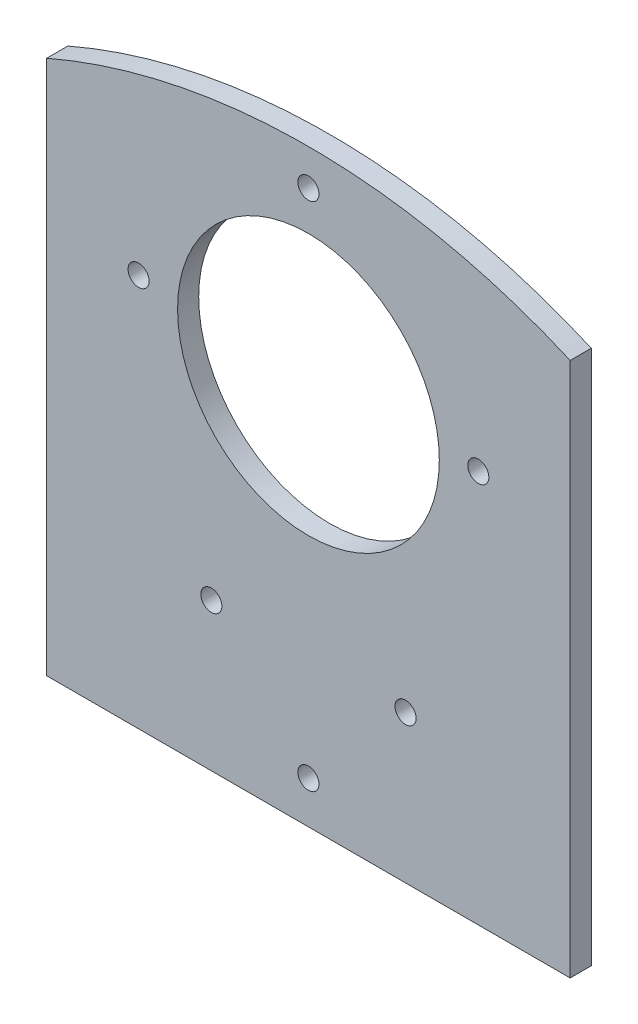
ISO-10303-21;
HEADER;
FILE_DESCRIPTION(('STEP AP214'),'2;1');
FILE_NAME('part.step','',(''),(''),'','','');
FILE_SCHEMA(('AUTOMOTIVE_DESIGN { 1 0 10303 214 1 1 1 1 }'));
ENDSEC;
DATA;
#1=APPLICATION_CONTEXT('core data for automotive mechanical design processes');
#2=APPLICATION_PROTOCOL_DEFINITION('international standard','automotive_design',2000,#1);
#3=PRODUCT_CONTEXT('',#1,'mechanical');
#4=PRODUCT('Part','Part','',(#3));
#5=PRODUCT_RELATED_PRODUCT_CATEGORY('part','',(#4));
#6=PRODUCT_DEFINITION_FORMATION('','',#4);
#7=PRODUCT_DEFINITION_CONTEXT('part definition',#1,'design');
#8=PRODUCT_DEFINITION('design','',#6,#7);
#9=PRODUCT_DEFINITION_SHAPE('','',#8);
#10=(LENGTH_UNIT() NAMED_UNIT(*) SI_UNIT(.MILLI.,.METRE.));
#11=(NAMED_UNIT(*) PLANE_ANGLE_UNIT() SI_UNIT($,.RADIAN.));
#12=(NAMED_UNIT(*) SI_UNIT($,.STERADIAN.) SOLID_ANGLE_UNIT());
#13=UNCERTAINTY_MEASURE_WITH_UNIT(LENGTH_MEASURE(1.E-05),#10,'distance_accuracy_value','');
#14=(GEOMETRIC_REPRESENTATION_CONTEXT(3) GLOBAL_UNCERTAINTY_ASSIGNED_CONTEXT((#13)) GLOBAL_UNIT_ASSIGNED_CONTEXT((#10,
#11,#12)) REPRESENTATION_CONTEXT('',''));
#15=CARTESIAN_POINT('',(0.,0.,0.));
#16=DIRECTION('',(0.,0.,1.));
#17=DIRECTION('',(1.,0.,0.));
#18=AXIS2_PLACEMENT_3D('',#15,#16,#17);
#19=CARTESIAN_POINT('',(-61.999999985,-87.3933536434245,4.1571428565));
#20=DIRECTION('',(1.,0.,0.));
#21=DIRECTION('',(0.,0.,-1.));
#22=AXIS2_PLACEMENT_3D('',#19,#20,#21);
#23=PLANE('',#22);
#24=DIRECTION('',(0.,1.,0.));
#25=VECTOR('',#24,1.);
#26=CARTESIAN_POINT('',(-61.999999985,-87.3933536434245,-0.8471428565));
#27=LINE('',#26,#25);
#28=CARTESIAN_POINT('',(-61.999999985,-48.8219250934244,-0.8471428565));
#29=VERTEX_POINT('',#28);
#30=CARTESIAN_POINT('',(-61.999999985,77.869494806171,-0.8471428565));
#31=VERTEX_POINT('',#30);
#32=EDGE_CURVE('E56',#29,#31,#27,.T.);
#33=ORIENTED_EDGE('',*,*,#32,.F.);
#34=DIRECTION('',(0.,0.,1.));
#35=VECTOR('',#34,1.);
#36=CARTESIAN_POINT('',(-61.999999985,-48.8219250934242,-5.8428571435));
#37=LINE('',#36,#35);
#38=CARTESIAN_POINT('',(-61.999999985,-48.8219250934242,4.1571428565));
#39=VERTEX_POINT('',#38);
#40=EDGE_CURVE('E49',#29,#39,#37,.T.);
#41=ORIENTED_EDGE('',*,*,#40,.T.);
#42=DIRECTION('',(0.,-1.,0.));
#43=VECTOR('',#42,1.);
#44=CARTESIAN_POINT('',(-61.999999985,-87.3933536434245,4.1571428565));
#45=LINE('',#44,#43);
#46=CARTESIAN_POINT('',(-61.999999985,77.869494806171,4.1571428565));
#47=VERTEX_POINT('',#46);
#48=EDGE_CURVE('E89',#47,#39,#45,.T.);
#49=ORIENTED_EDGE('',*,*,#48,.F.);
#50=DIRECTION('',(0.,0.,1.));
#51=VECTOR('',#50,1.);
#52=CARTESIAN_POINT('',(-61.999999985,77.869494806171,-13.5571428535));
#53=LINE('',#52,#51);
#54=EDGE_CURVE('E101',#31,#47,#53,.T.);
#55=ORIENTED_EDGE('',*,*,#54,.F.);
#56=EDGE_LOOP('',(#33,#41,#49,#55));
#57=FACE_BOUND('',#56,.T.);
#58=ADVANCED_FACE('F36',(#57),#23,.F.);
#59=CARTESIAN_POINT('',(61.999999985,-87.3933536434244,4.1571428565));
#60=DIRECTION('',(-1.,0.,0.));
#61=DIRECTION('',(0.,0.,1.));
#62=AXIS2_PLACEMENT_3D('',#59,#60,#61);
#63=PLANE('',#62);
#64=DIRECTION('',(0.,1.,0.));
#65=VECTOR('',#64,1.);
#66=CARTESIAN_POINT('',(61.999999985,-87.3933536434244,4.1571428565));
#67=LINE('',#66,#65);
#68=CARTESIAN_POINT('',(61.999999985,-48.8219250934246,4.1571428565));
#69=VERTEX_POINT('',#68);
#70=CARTESIAN_POINT('',(61.999999985,77.869494806171,4.1571428565));
#71=VERTEX_POINT('',#70);
#72=EDGE_CURVE('E43',#69,#71,#67,.T.);
#73=ORIENTED_EDGE('',*,*,#72,.F.);
#74=DIRECTION('',(0.,0.,1.));
#75=VECTOR('',#74,1.);
#76=CARTESIAN_POINT('',(61.999999985,-48.8219250934246,-5.8428571435));
#77=LINE('',#76,#75);
#78=CARTESIAN_POINT('',(61.999999985,-48.8219250934246,-0.8471428565));
#79=VERTEX_POINT('',#78);
#80=EDGE_CURVE('E73',#79,#69,#77,.T.);
#81=ORIENTED_EDGE('',*,*,#80,.F.);
#82=DIRECTION('',(0.,-1.,0.));
#83=VECTOR('',#82,1.);
#84=CARTESIAN_POINT('',(61.999999985,77.869494806171,-0.8471428565));
#85=LINE('',#84,#83);
#86=CARTESIAN_POINT('',(61.999999985,77.869494806171,-0.8471428565));
#87=VERTEX_POINT('',#86);
#88=EDGE_CURVE('E106',#87,#79,#85,.T.);
#89=ORIENTED_EDGE('',*,*,#88,.F.);
#90=DIRECTION('',(0.,0.,1.));
#91=VECTOR('',#90,1.);
#92=CARTESIAN_POINT('',(61.999999985,77.869494806171,-13.5571428535));
#93=LINE('',#92,#91);
#94=EDGE_CURVE('E94',#87,#71,#93,.T.);
#95=ORIENTED_EDGE('',*,*,#94,.T.);
#96=EDGE_LOOP('',(#73,#81,#89,#95));
#97=FACE_BOUND('',#96,.T.);
#98=ADVANCED_FACE('F92',(#97),#63,.F.);
#99=CARTESIAN_POINT('',(0.,41.9209320395755,4.1571428565));
#100=DIRECTION('',(0.,0.,-1.));
#101=DIRECTION('',(-1.,0.,0.));
#102=AXIS2_PLACEMENT_3D('',#99,#100,#101);
#103=CYLINDRICAL_SURFACE('',#102,30.9999999925);
#104=CARTESIAN_POINT('',(0.,41.9209320395755,4.1571428565));
#105=DIRECTION('',(0.,0.,-1.));
#106=DIRECTION('',(-1.,0.,0.));
#107=AXIS2_PLACEMENT_3D('',#104,#105,#106);
#108=CIRCLE('',#107,30.9999999925);
#109=CARTESIAN_POINT('',(-30.9999999925,41.9209320395755,4.1571428565));
#110=VERTEX_POINT('',#109);
#111=EDGE_CURVE('E96',#110,#110,#108,.T.);
#112=ORIENTED_EDGE('',*,*,#111,.F.);
#113=EDGE_LOOP('',(#112));
#114=FACE_BOUND('',#113,.T.);
#115=CARTESIAN_POINT('',(0.,41.9209320395755,-0.8471428565));
#116=DIRECTION('',(0.,0.,-1.));
#117=DIRECTION('',(-1.,0.,0.));
#118=AXIS2_PLACEMENT_3D('',#115,#116,#117);
#119=CIRCLE('',#118,30.9999999925);
#120=CARTESIAN_POINT('',(-30.9999999925,41.9209320395755,-0.8471428565));
#121=VERTEX_POINT('',#120);
#122=EDGE_CURVE('E111',#121,#121,#119,.T.);
#123=ORIENTED_EDGE('',*,*,#122,.T.);
#124=EDGE_LOOP('',(#123));
#125=FACE_BOUND('',#124,.T.);
#126=ADVANCED_FACE('F182',(#114,#125),#103,.F.);
#127=CARTESIAN_POINT('',(0.,-64.6590896481976,-13.5571428535));
#128=DIRECTION('',(0.,0.,1.));
#129=DIRECTION('',(1.,0.,0.));
#130=AXIS2_PLACEMENT_3D('',#127,#128,#129);
#131=CYLINDRICAL_SURFACE('',#130,155.429718473354);
#132=CARTESIAN_POINT('',(0.,-64.6590896481976,-0.8471428565));
#133=DIRECTION('',(0.,0.,-1.));
#134=DIRECTION('',(-1.,0.,0.));
#135=AXIS2_PLACEMENT_3D('',#132,#133,#134);
#136=CIRCLE('',#135,155.429718473354);
#137=EDGE_CURVE('E108',#31,#87,#136,.T.);
#138=ORIENTED_EDGE('',*,*,#137,.F.);
#139=ORIENTED_EDGE('',*,*,#54,.T.);
#140=CARTESIAN_POINT('',(0.,-64.6590896481976,4.1571428565));
#141=DIRECTION('',(0.,0.,-1.));
#142=DIRECTION('',(-1.,0.,0.));
#143=AXIS2_PLACEMENT_3D('',#140,#141,#142);
#144=CIRCLE('',#143,155.429718473354);
#145=EDGE_CURVE('E103',#47,#71,#144,.T.);
#146=ORIENTED_EDGE('',*,*,#145,.T.);
#147=ORIENTED_EDGE('',*,*,#94,.F.);
#148=EDGE_LOOP('',(#138,#139,#146,#147));
#149=FACE_BOUND('',#148,.T.);
#150=ADVANCED_FACE('F157',(#149),#131,.T.);
#151=CARTESIAN_POINT('',(0.,5.60664633407555,4.1571428565));
#152=DIRECTION('',(0.,0.,1.));
#153=DIRECTION('',(1.,0.,0.));
#154=AXIS2_PLACEMENT_3D('',#151,#152,#153);
#155=PLANE('',#154);
#156=CARTESIAN_POINT('',(-40.2334024909349,44.2368171840592,4.1571428565));
#157=DIRECTION('',(0.,0.,1.));
#158=DIRECTION('',(1.,0.,0.));
#159=AXIS2_PLACEMENT_3D('',#156,#157,#158);
#160=CIRCLE('',#159,2.5);
#161=CARTESIAN_POINT('',(-37.7334024909349,44.2368171840592,4.1571428565));
#162=VERTEX_POINT('',#161);
#163=EDGE_CURVE('E143',#162,#162,#160,.T.);
#164=ORIENTED_EDGE('',*,*,#163,.F.);
#165=EDGE_LOOP('',(#164));
#166=FACE_BOUND('',#165,.T.);
#167=CARTESIAN_POINT('',(0.,82.2209320395757,4.1571428565));
#168=DIRECTION('',(0.,0.,1.));
#169=DIRECTION('',(1.,0.,0.));
#170=AXIS2_PLACEMENT_3D('',#167,#168,#169);
#171=CIRCLE('',#170,2.5);
#172=CARTESIAN_POINT('',(2.49999999999995,82.2209320395757,4.1571428565));
#173=VERTEX_POINT('',#172);
#174=EDGE_CURVE('E136',#173,#173,#171,.T.);
#175=ORIENTED_EDGE('',*,*,#174,.F.);
#176=EDGE_LOOP('',(#175));
#177=FACE_BOUND('',#176,.T.);
#178=CARTESIAN_POINT('',(40.2334007714421,44.2368470562634,4.1571428565));
#179=DIRECTION('',(0.,0.,1.));
#180=DIRECTION('',(1.,0.,0.));
#181=AXIS2_PLACEMENT_3D('',#178,#179,#180);
#182=CIRCLE('',#181,2.5);
#183=CARTESIAN_POINT('',(42.7334007714421,44.2368470562634,4.1571428565));
#184=VERTEX_POINT('',#183);
#185=EDGE_CURVE('E137',#184,#184,#182,.T.);
#186=ORIENTED_EDGE('',*,*,#185,.F.);
#187=EDGE_LOOP('',(#186));
#188=FACE_BOUND('',#187,.T.);
#189=CARTESIAN_POINT('',(22.9999999999995,-13.8219250934245,4.1571428565));
#190=DIRECTION('',(0.,0.,1.));
#191=DIRECTION('',(1.,0.,0.));
#192=AXIS2_PLACEMENT_3D('',#189,#190,#191);
#193=CIRCLE('',#192,2.5);
#194=CARTESIAN_POINT('',(25.4999999999995,-13.8219250934245,4.1571428565));
#195=VERTEX_POINT('',#194);
#196=EDGE_CURVE('E126',#195,#195,#193,.T.);
#197=ORIENTED_EDGE('',*,*,#196,.F.);
#198=EDGE_LOOP('',(#197));
#199=FACE_BOUND('',#198,.T.);
#200=CARTESIAN_POINT('',(-23.0000000000005,-13.8219250934243,4.1571428565));
#201=DIRECTION('',(0.,0.,1.));
#202=DIRECTION('',(1.,0.,0.));
#203=AXIS2_PLACEMENT_3D('',#200,#201,#202);
#204=CIRCLE('',#203,2.5);
#205=CARTESIAN_POINT('',(-20.5000000000005,-13.8219250934243,4.1571428565));
#206=VERTEX_POINT('',#205);
#207=EDGE_CURVE('E118',#206,#206,#204,.T.);
#208=ORIENTED_EDGE('',*,*,#207,.F.);
#209=EDGE_LOOP('',(#208));
#210=FACE_BOUND('',#209,.T.);
#211=CARTESIAN_POINT('',(-6.10622663543836E-13,-38.8219250934244,4.1571428565));
#212=DIRECTION('',(0.,0.,1.));
#213=DIRECTION('',(1.,0.,0.));
#214=AXIS2_PLACEMENT_3D('',#211,#212,#213);
#215=CIRCLE('',#214,2.5);
#216=CARTESIAN_POINT('',(2.49999999999939,-38.8219250934244,4.1571428565));
#217=VERTEX_POINT('',#216);
#218=EDGE_CURVE('E119',#217,#217,#215,.T.);
#219=ORIENTED_EDGE('',*,*,#218,.F.);
#220=EDGE_LOOP('',(#219));
#221=FACE_BOUND('',#220,.T.);
#222=DIRECTION('',(-1.,0.,0.));
#223=VECTOR('',#222,1.);
#224=CARTESIAN_POINT('',(61.999999985,-48.8219250934246,4.1571428565));
#225=LINE('',#224,#223);
#226=EDGE_CURVE('E76',#69,#39,#225,.T.);
#227=ORIENTED_EDGE('',*,*,#226,.F.);
#228=ORIENTED_EDGE('',*,*,#72,.T.);
#229=ORIENTED_EDGE('',*,*,#145,.F.);
#230=ORIENTED_EDGE('',*,*,#48,.T.);
#231=EDGE_LOOP('',(#227,#228,#229,#230));
#232=FACE_BOUND('',#231,.T.);
#233=ORIENTED_EDGE('',*,*,#111,.T.);
#234=EDGE_LOOP('',(#233));
#235=FACE_BOUND('',#234,.T.);
#236=ADVANCED_FACE('F84',(#166,#177,#188,#199,#210,#221,#232,#235),#155,.T.);
#237=CARTESIAN_POINT('',(0.,-64.6590896481976,-0.8471428565));
#238=DIRECTION('',(0.,0.,-1.));
#239=DIRECTION('',(-1.,0.,0.));
#240=AXIS2_PLACEMENT_3D('',#237,#238,#239);
#241=PLANE('',#240);
#242=CARTESIAN_POINT('',(-40.2334024909349,44.2368171840592,-0.8471428565));
#243=DIRECTION('',(0.,0.,-1.));
#244=DIRECTION('',(-1.,0.,0.));
#245=AXIS2_PLACEMENT_3D('',#242,#243,#244);
#246=CIRCLE('',#245,2.5);
#247=CARTESIAN_POINT('',(-37.7334024909349,44.2368171840592,-0.847142856499999));
#248=VERTEX_POINT('',#247);
#249=EDGE_CURVE('E122',#248,#248,#246,.F.);
#250=ORIENTED_EDGE('',*,*,#249,.T.);
#251=EDGE_LOOP('',(#250));
#252=FACE_BOUND('',#251,.T.);
#253=CARTESIAN_POINT('',(0.,82.2209320395757,-0.8471428565));
#254=DIRECTION('',(0.,0.,-1.));
#255=DIRECTION('',(-1.,0.,0.));
#256=AXIS2_PLACEMENT_3D('',#253,#254,#255);
#257=CIRCLE('',#256,2.5);
#258=CARTESIAN_POINT('',(2.49999999999995,82.2209320395757,-0.847142856499999));
#259=VERTEX_POINT('',#258);
#260=EDGE_CURVE('E140',#259,#259,#257,.F.);
#261=ORIENTED_EDGE('',*,*,#260,.T.);
#262=EDGE_LOOP('',(#261));
#263=FACE_BOUND('',#262,.T.);
#264=CARTESIAN_POINT('',(40.2334007714421,44.2368470562634,-0.8471428565));
#265=DIRECTION('',(0.,0.,-1.));
#266=DIRECTION('',(-1.,0.,0.));
#267=AXIS2_PLACEMENT_3D('',#264,#265,#266);
#268=CIRCLE('',#267,2.5);
#269=CARTESIAN_POINT('',(42.7334007714421,44.2368470562634,-0.847142856499999));
#270=VERTEX_POINT('',#269);
#271=EDGE_CURVE('E133',#270,#270,#268,.F.);
#272=ORIENTED_EDGE('',*,*,#271,.T.);
#273=EDGE_LOOP('',(#272));
#274=FACE_BOUND('',#273,.T.);
#275=CARTESIAN_POINT('',(22.9999999999995,-13.8219250934245,-0.8471428565));
#276=DIRECTION('',(0.,0.,-1.));
#277=DIRECTION('',(-1.,0.,0.));
#278=AXIS2_PLACEMENT_3D('',#275,#276,#277);
#279=CIRCLE('',#278,2.5);
#280=CARTESIAN_POINT('',(20.4999999999995,-13.8219250934245,-0.8471428565));
#281=VERTEX_POINT('',#280);
#282=EDGE_CURVE('E90',#281,#281,#279,.F.);
#283=ORIENTED_EDGE('',*,*,#282,.T.);
#284=EDGE_LOOP('',(#283));
#285=FACE_BOUND('',#284,.T.);
#286=CARTESIAN_POINT('',(-23.0000000000005,-13.8219250934243,-0.8471428565));
#287=DIRECTION('',(0.,0.,-1.));
#288=DIRECTION('',(-1.,0.,0.));
#289=AXIS2_PLACEMENT_3D('',#286,#287,#288);
#290=CIRCLE('',#289,2.5);
#291=CARTESIAN_POINT('',(-25.5000000000005,-13.8219250934243,-0.8471428565));
#292=VERTEX_POINT('',#291);
#293=EDGE_CURVE('E123',#292,#292,#290,.F.);
#294=ORIENTED_EDGE('',*,*,#293,.T.);
#295=EDGE_LOOP('',(#294));
#296=FACE_BOUND('',#295,.T.);
#297=CARTESIAN_POINT('',(-6.10622663543836E-13,-38.8219250934244,-0.8471428565));
#298=DIRECTION('',(0.,0.,-1.));
#299=DIRECTION('',(-1.,0.,0.));
#300=AXIS2_PLACEMENT_3D('',#297,#298,#299);
#301=CIRCLE('',#300,2.5);
#302=CARTESIAN_POINT('',(-2.50000000000061,-38.8219250934244,-0.8471428565));
#303=VERTEX_POINT('',#302);
#304=EDGE_CURVE('E115',#303,#303,#301,.F.);
#305=ORIENTED_EDGE('',*,*,#304,.T.);
#306=EDGE_LOOP('',(#305));
#307=FACE_BOUND('',#306,.T.);
#308=DIRECTION('',(1.,0.,0.));
#309=VECTOR('',#308,1.);
#310=CARTESIAN_POINT('',(0.,-48.8219250934244,-0.8471428565));
#311=LINE('',#310,#309);
#312=EDGE_CURVE('E11',#29,#79,#311,.T.);
#313=ORIENTED_EDGE('',*,*,#312,.F.);
#314=ORIENTED_EDGE('',*,*,#32,.T.);
#315=ORIENTED_EDGE('',*,*,#137,.T.);
#316=ORIENTED_EDGE('',*,*,#88,.T.);
#317=EDGE_LOOP('',(#313,#314,#315,#316));
#318=FACE_BOUND('',#317,.T.);
#319=ORIENTED_EDGE('',*,*,#122,.F.);
#320=EDGE_LOOP('',(#319));
#321=FACE_BOUND('',#320,.T.);
#322=ADVANCED_FACE('F156',(#252,#263,#274,#285,#296,#307,#318,#321),#241,.T.);
#323=CARTESIAN_POINT('',(61.999999985,-48.8219250934246,-5.8428571435));
#324=DIRECTION('',(0.,1.,0.));
#325=DIRECTION('',(-1.,0.,0.));
#326=AXIS2_PLACEMENT_3D('',#323,#324,#325);
#327=PLANE('',#326);
#328=ORIENTED_EDGE('',*,*,#312,.T.);
#329=ORIENTED_EDGE('',*,*,#80,.T.);
#330=ORIENTED_EDGE('',*,*,#226,.T.);
#331=ORIENTED_EDGE('',*,*,#40,.F.);
#332=EDGE_LOOP('',(#328,#329,#330,#331));
#333=FACE_BOUND('',#332,.T.);
#334=ADVANCED_FACE('F75',(#333),#327,.F.);
#335=CARTESIAN_POINT('',(-6.10622663543836E-13,-38.8219250934244,-7.91821066836548));
#336=DIRECTION('',(0.,0.,1.));
#337=DIRECTION('',(1.,0.,0.));
#338=AXIS2_PLACEMENT_3D('',#335,#336,#337);
#339=CYLINDRICAL_SURFACE('',#338,2.5);
#340=ORIENTED_EDGE('',*,*,#218,.T.);
#341=EDGE_LOOP('',(#340));
#342=FACE_BOUND('',#341,.T.);
#343=ORIENTED_EDGE('',*,*,#304,.F.);
#344=EDGE_LOOP('',(#343));
#345=FACE_BOUND('',#344,.T.);
#346=ADVANCED_FACE('F169',(#342,#345),#339,.F.);
#347=CARTESIAN_POINT('',(-23.0000000000005,-13.8219250934243,-7.91821066836548));
#348=DIRECTION('',(0.,0.,1.));
#349=DIRECTION('',(1.,0.,0.));
#350=AXIS2_PLACEMENT_3D('',#347,#348,#349);
#351=CYLINDRICAL_SURFACE('',#350,2.5);
#352=ORIENTED_EDGE('',*,*,#207,.T.);
#353=EDGE_LOOP('',(#352));
#354=FACE_BOUND('',#353,.T.);
#355=ORIENTED_EDGE('',*,*,#293,.F.);
#356=EDGE_LOOP('',(#355));
#357=FACE_BOUND('',#356,.T.);
#358=ADVANCED_FACE('F172',(#354,#357),#351,.F.);
#359=CARTESIAN_POINT('',(22.9999999999995,-13.8219250934245,-7.91821066836548));
#360=DIRECTION('',(0.,0.,1.));
#361=DIRECTION('',(1.,0.,0.));
#362=AXIS2_PLACEMENT_3D('',#359,#360,#361);
#363=CYLINDRICAL_SURFACE('',#362,2.5);
#364=ORIENTED_EDGE('',*,*,#196,.T.);
#365=EDGE_LOOP('',(#364));
#366=FACE_BOUND('',#365,.T.);
#367=ORIENTED_EDGE('',*,*,#282,.F.);
#368=EDGE_LOOP('',(#367));
#369=FACE_BOUND('',#368,.T.);
#370=ADVANCED_FACE('F228',(#366,#369),#363,.F.);
#371=CARTESIAN_POINT('',(40.2334007714421,44.2368470562634,-7.91821066836548));
#372=DIRECTION('',(0.,0.,1.));
#373=DIRECTION('',(1.,0.,0.));
#374=AXIS2_PLACEMENT_3D('',#371,#372,#373);
#375=CYLINDRICAL_SURFACE('',#374,2.5);
#376=CARTESIAN_POINT('',(42.7334007714421,44.2368470562634,4.1571428565));
#377=CARTESIAN_POINT('',(42.7334007714421,44.2368470562634,4.10501488032291));
#378=CARTESIAN_POINT('',(42.7334007714421,44.2368470562634,4.05288690414583));
#379=CARTESIAN_POINT('',(42.7334007714421,44.2368470562634,3.94863095179167));
#380=CARTESIAN_POINT('',(42.7334007714421,44.2368470562634,3.89650297561458));
#381=CARTESIAN_POINT('',(42.7334007714421,44.2368470562634,3.79224702326042));
#382=CARTESIAN_POINT('',(42.7334007714421,44.2368470562634,3.74011904708333));
#383=CARTESIAN_POINT('',(42.7334007714421,44.2368470562634,3.63586309472917));
#384=CARTESIAN_POINT('',(42.7334007714421,44.2368470562634,3.58373511855208));
#385=CARTESIAN_POINT('',(42.7334007714421,44.2368470562634,3.47947916619791));
#386=CARTESIAN_POINT('',(42.7334007714421,44.2368470562634,3.42735119002083));
#387=CARTESIAN_POINT('',(42.7334007714421,44.2368470562634,3.32309523766667));
#388=CARTESIAN_POINT('',(42.7334007714421,44.2368470562634,3.27096726148958));
#389=CARTESIAN_POINT('',(42.7334007714421,44.2368470562634,3.16671130913542));
#390=CARTESIAN_POINT('',(42.7334007714421,44.2368470562634,3.11458333295833));
#391=CARTESIAN_POINT('',(42.7334007714421,44.2368470562634,3.01032738060417));
#392=CARTESIAN_POINT('',(42.7334007714421,44.2368470562634,2.95819940442708));
#393=CARTESIAN_POINT('',(42.7334007714421,44.2368470562634,2.85394345207292));
#394=CARTESIAN_POINT('',(42.7334007714421,44.2368470562634,2.80181547589583));
#395=CARTESIAN_POINT('',(42.7334007714421,44.2368470562634,2.69755952354167));
#396=CARTESIAN_POINT('',(42.7334007714421,44.2368470562634,2.64543154736458));
#397=CARTESIAN_POINT('',(42.7334007714421,44.2368470562634,2.54117559501042));
#398=CARTESIAN_POINT('',(42.7334007714421,44.2368470562634,2.48904761883333));
#399=CARTESIAN_POINT('',(42.7334007714421,44.2368470562634,2.38479166647917));
#400=CARTESIAN_POINT('',(42.7334007714421,44.2368470562634,2.33266369030208));
#401=CARTESIAN_POINT('',(42.7334007714421,44.2368470562634,2.22840773794792));
#402=CARTESIAN_POINT('',(42.7334007714421,44.2368470562634,2.17627976177083));
#403=CARTESIAN_POINT('',(42.7334007714421,44.2368470562634,2.07202380941667));
#404=CARTESIAN_POINT('',(42.7334007714421,44.2368470562634,2.01989583323958));
#405=CARTESIAN_POINT('',(42.7334007714421,44.2368470562634,1.91563988088542));
#406=CARTESIAN_POINT('',(42.7334007714421,44.2368470562634,1.86351190470833));
#407=CARTESIAN_POINT('',(42.7334007714421,44.2368470562634,1.75925595235417));
#408=CARTESIAN_POINT('',(42.7334007714421,44.2368470562634,1.70712797617708));
#409=CARTESIAN_POINT('',(42.7334007714421,44.2368470562634,1.60287202382292));
#410=CARTESIAN_POINT('',(42.7334007714421,44.2368470562634,1.55074404764583));
#411=CARTESIAN_POINT('',(42.7334007714421,44.2368470562634,1.44648809529167));
#412=CARTESIAN_POINT('',(42.7334007714421,44.2368470562634,1.39436011911458));
#413=CARTESIAN_POINT('',(42.7334007714421,44.2368470562634,1.29010416676042));
#414=CARTESIAN_POINT('',(42.7334007714421,44.2368470562634,1.23797619058333));
#415=CARTESIAN_POINT('',(42.7334007714421,44.2368470562634,1.13372023822917));
#416=CARTESIAN_POINT('',(42.7334007714421,44.2368470562634,1.08159226205208));
#417=CARTESIAN_POINT('',(42.7334007714421,44.2368470562634,0.977336309697917));
#418=CARTESIAN_POINT('',(42.7334007714421,44.2368470562634,0.925208333520833));
#419=CARTESIAN_POINT('',(42.7334007714421,44.2368470562634,0.820952381166666));
#420=CARTESIAN_POINT('',(42.7334007714421,44.2368470562634,0.768824404989582));
#421=CARTESIAN_POINT('',(42.7334007714421,44.2368470562634,0.664568452635416));
#422=CARTESIAN_POINT('',(42.7334007714421,44.2368470562634,0.612440476458333));
#423=CARTESIAN_POINT('',(42.7334007714421,44.2368470562634,0.508184524104167));
#424=CARTESIAN_POINT('',(42.7334007714421,44.2368470562634,0.456056547927083));
#425=CARTESIAN_POINT('',(42.7334007714421,44.2368470562634,0.351800595572916));
#426=CARTESIAN_POINT('',(42.7334007714421,44.2368470562634,0.299672619395833));
#427=CARTESIAN_POINT('',(42.7334007714421,44.2368470562634,0.195416667041666));
#428=CARTESIAN_POINT('',(42.7334007714421,44.2368470562634,0.143288690864583));
#429=CARTESIAN_POINT('',(42.7334007714421,44.2368470562634,0.0390327385104168));
#430=CARTESIAN_POINT('',(42.7334007714421,44.2368470562634,-0.0130952376666665));
#431=CARTESIAN_POINT('',(42.7334007714421,44.2368470562634,-0.117351190020833));
#432=CARTESIAN_POINT('',(42.7334007714421,44.2368470562634,-0.169479166197916));
#433=CARTESIAN_POINT('',(42.7334007714421,44.2368470562634,-0.273735118552083));
#434=CARTESIAN_POINT('',(42.7334007714421,44.2368470562634,-0.325863094729166));
#435=CARTESIAN_POINT('',(42.7334007714421,44.2368470562634,-0.430119047083332));
#436=CARTESIAN_POINT('',(42.7334007714421,44.2368470562634,-0.482247023260415));
#437=CARTESIAN_POINT('',(42.7334007714421,44.2368470562634,-0.586502975614582));
#438=CARTESIAN_POINT('',(42.7334007714421,44.2368470562634,-0.638630951791666));
#439=CARTESIAN_POINT('',(42.7334007714421,44.2368470562634,-0.742886904145832));
#440=CARTESIAN_POINT('',(42.7334007714421,44.2368470562634,-0.795014880322916));
#441=CARTESIAN_POINT('',(42.7334007714421,44.2368470562634,-0.847142856499999));
#442=B_SPLINE_CURVE_WITH_KNOTS('',3,(#376,#377,#378,#379,#380,#381,#382,#383,#384,#385,#386,
#387,#388,#389,#390,#391,#392,#393,#394,#395,#396,#397,#398,#399,#400,#401,#402,#403,#404,#405,
#406,#407,#408,#409,#410,#411,#412,#413,#414,#415,#416,#417,#418,#419,#420,#421,#422,#423,#424,
#425,#426,#427,#428,#429,#430,#431,#432,#433,#434,#435,#436,#437,#438,#439,#440,#441),
.UNSPECIFIED.,.F.,.F.,(4,2,2,2,2,2,2,2,2,2,2,2,2,2,2,2,2,2,2,2,2,2,2,2,2,2,2,2,2,2,2,2,4),(0.,
0.15638392853125,0.312767857062499,0.469151785593749,0.625535714125,0.78191964265625,
0.9383035711875,1.09468749971875,1.25107142825,1.40745535678125,1.5638392853125,
1.72022321384375,1.876607142375,2.03299107090625,2.1893749994375,2.34575892796875,2.5021428565,
2.65852678503125,2.8149107135625,2.97129464209375,3.127678570625,3.28406249915625,
3.4404464276875,3.59683035621875,3.75321428475,3.90959821328125,4.0659821418125,
4.22236607034375,4.378749998875,4.53513392740625,4.6915178559375,4.84790178446875,5.004285713),.UNSPECIFIED.);
#443=EDGE_CURVE('BSEAM237',#184,#270,#442,.T.);
#444=ORIENTED_EDGE('',*,*,#185,.T.);
#445=ORIENTED_EDGE('',*,*,#271,.F.);
#446=ORIENTED_EDGE('',*,*,#443,.T.);
#447=ORIENTED_EDGE('',*,*,#443,.F.);
#448=EDGE_LOOP('',(#444,#446,#445,#447));
#449=FACE_BOUND('',#448,.T.);
#450=ADVANCED_FACE('F237',(#449),#375,.F.);
#451=CARTESIAN_POINT('',(0.,82.2209320395757,-7.91821066836548));
#452=DIRECTION('',(0.,0.,1.));
#453=DIRECTION('',(1.,0.,0.));
#454=AXIS2_PLACEMENT_3D('',#451,#452,#453);
#455=CYLINDRICAL_SURFACE('',#454,2.5);
#456=CARTESIAN_POINT('',(2.49999999999995,82.2209320395757,4.1571428565));
#457=CARTESIAN_POINT('',(2.49999999999995,82.2209320395757,4.10501488032291));
#458=CARTESIAN_POINT('',(2.49999999999995,82.2209320395757,4.05288690414583));
#459=CARTESIAN_POINT('',(2.49999999999995,82.2209320395757,3.94863095179167));
#460=CARTESIAN_POINT('',(2.49999999999995,82.2209320395757,3.89650297561458));
#461=CARTESIAN_POINT('',(2.49999999999995,82.2209320395757,3.79224702326042));
#462=CARTESIAN_POINT('',(2.49999999999995,82.2209320395757,3.74011904708333));
#463=CARTESIAN_POINT('',(2.49999999999995,82.2209320395757,3.63586309472917));
#464=CARTESIAN_POINT('',(2.49999999999995,82.2209320395757,3.58373511855208));
#465=CARTESIAN_POINT('',(2.49999999999995,82.2209320395757,3.47947916619791));
#466=CARTESIAN_POINT('',(2.49999999999995,82.2209320395757,3.42735119002083));
#467=CARTESIAN_POINT('',(2.49999999999995,82.2209320395757,3.32309523766667));
#468=CARTESIAN_POINT('',(2.49999999999995,82.2209320395757,3.27096726148958));
#469=CARTESIAN_POINT('',(2.49999999999995,82.2209320395757,3.16671130913542));
#470=CARTESIAN_POINT('',(2.49999999999995,82.2209320395757,3.11458333295833));
#471=CARTESIAN_POINT('',(2.49999999999995,82.2209320395757,3.01032738060417));
#472=CARTESIAN_POINT('',(2.49999999999995,82.2209320395757,2.95819940442708));
#473=CARTESIAN_POINT('',(2.49999999999995,82.2209320395757,2.85394345207292));
#474=CARTESIAN_POINT('',(2.49999999999995,82.2209320395757,2.80181547589583));
#475=CARTESIAN_POINT('',(2.49999999999995,82.2209320395757,2.69755952354167));
#476=CARTESIAN_POINT('',(2.49999999999995,82.2209320395757,2.64543154736458));
#477=CARTESIAN_POINT('',(2.49999999999995,82.2209320395757,2.54117559501042));
#478=CARTESIAN_POINT('',(2.49999999999995,82.2209320395757,2.48904761883333));
#479=CARTESIAN_POINT('',(2.49999999999995,82.2209320395757,2.38479166647917));
#480=CARTESIAN_POINT('',(2.49999999999995,82.2209320395757,2.33266369030208));
#481=CARTESIAN_POINT('',(2.49999999999995,82.2209320395757,2.22840773794792));
#482=CARTESIAN_POINT('',(2.49999999999995,82.2209320395757,2.17627976177083));
#483=CARTESIAN_POINT('',(2.49999999999995,82.2209320395757,2.07202380941667));
#484=CARTESIAN_POINT('',(2.49999999999995,82.2209320395757,2.01989583323958));
#485=CARTESIAN_POINT('',(2.49999999999995,82.2209320395757,1.91563988088542));
#486=CARTESIAN_POINT('',(2.49999999999995,82.2209320395757,1.86351190470833));
#487=CARTESIAN_POINT('',(2.49999999999995,82.2209320395757,1.75925595235417));
#488=CARTESIAN_POINT('',(2.49999999999995,82.2209320395757,1.70712797617708));
#489=CARTESIAN_POINT('',(2.49999999999995,82.2209320395757,1.60287202382292));
#490=CARTESIAN_POINT('',(2.49999999999995,82.2209320395757,1.55074404764583));
#491=CARTESIAN_POINT('',(2.49999999999995,82.2209320395757,1.44648809529167));
#492=CARTESIAN_POINT('',(2.49999999999995,82.2209320395757,1.39436011911458));
#493=CARTESIAN_POINT('',(2.49999999999995,82.2209320395757,1.29010416676042));
#494=CARTESIAN_POINT('',(2.49999999999995,82.2209320395757,1.23797619058333));
#495=CARTESIAN_POINT('',(2.49999999999995,82.2209320395757,1.13372023822917));
#496=CARTESIAN_POINT('',(2.49999999999995,82.2209320395757,1.08159226205208));
#497=CARTESIAN_POINT('',(2.49999999999995,82.2209320395757,0.977336309697917));
#498=CARTESIAN_POINT('',(2.49999999999995,82.2209320395757,0.925208333520833));
#499=CARTESIAN_POINT('',(2.49999999999995,82.2209320395757,0.820952381166666));
#500=CARTESIAN_POINT('',(2.49999999999995,82.2209320395757,0.768824404989582));
#501=CARTESIAN_POINT('',(2.49999999999995,82.2209320395757,0.664568452635416));
#502=CARTESIAN_POINT('',(2.49999999999995,82.2209320395757,0.612440476458333));
#503=CARTESIAN_POINT('',(2.49999999999995,82.2209320395757,0.508184524104167));
#504=CARTESIAN_POINT('',(2.49999999999995,82.2209320395757,0.456056547927083));
#505=CARTESIAN_POINT('',(2.49999999999995,82.2209320395757,0.351800595572916));
#506=CARTESIAN_POINT('',(2.49999999999995,82.2209320395757,0.299672619395833));
#507=CARTESIAN_POINT('',(2.49999999999995,82.2209320395757,0.195416667041666));
#508=CARTESIAN_POINT('',(2.49999999999995,82.2209320395757,0.143288690864583));
#509=CARTESIAN_POINT('',(2.49999999999995,82.2209320395757,0.0390327385104168));
#510=CARTESIAN_POINT('',(2.49999999999995,82.2209320395757,-0.0130952376666665));
#511=CARTESIAN_POINT('',(2.49999999999995,82.2209320395757,-0.117351190020833));
#512=CARTESIAN_POINT('',(2.49999999999995,82.2209320395757,-0.169479166197916));
#513=CARTESIAN_POINT('',(2.49999999999995,82.2209320395757,-0.273735118552083));
#514=CARTESIAN_POINT('',(2.49999999999995,82.2209320395757,-0.325863094729166));
#515=CARTESIAN_POINT('',(2.49999999999995,82.2209320395757,-0.430119047083332));
#516=CARTESIAN_POINT('',(2.49999999999995,82.2209320395757,-0.482247023260415));
#517=CARTESIAN_POINT('',(2.49999999999995,82.2209320395757,-0.586502975614582));
#518=CARTESIAN_POINT('',(2.49999999999995,82.2209320395757,-0.638630951791666));
#519=CARTESIAN_POINT('',(2.49999999999995,82.2209320395757,-0.742886904145832));
#520=CARTESIAN_POINT('',(2.49999999999995,82.2209320395757,-0.795014880322916));
#521=CARTESIAN_POINT('',(2.49999999999995,82.2209320395757,-0.847142856499999));
#522=B_SPLINE_CURVE_WITH_KNOTS('',3,(#456,#457,#458,#459,#460,#461,#462,#463,#464,#465,#466,
#467,#468,#469,#470,#471,#472,#473,#474,#475,#476,#477,#478,#479,#480,#481,#482,#483,#484,#485,
#486,#487,#488,#489,#490,#491,#492,#493,#494,#495,#496,#497,#498,#499,#500,#501,#502,#503,#504,
#505,#506,#507,#508,#509,#510,#511,#512,#513,#514,#515,#516,#517,#518,#519,#520,#521),
.UNSPECIFIED.,.F.,.F.,(4,2,2,2,2,2,2,2,2,2,2,2,2,2,2,2,2,2,2,2,2,2,2,2,2,2,2,2,2,2,2,2,4),(0.,
0.15638392853125,0.312767857062499,0.469151785593749,0.625535714125,0.78191964265625,
0.9383035711875,1.09468749971875,1.25107142825,1.40745535678125,1.5638392853125,
1.72022321384375,1.876607142375,2.03299107090625,2.1893749994375,2.34575892796875,2.5021428565,
2.65852678503125,2.8149107135625,2.97129464209375,3.127678570625,3.28406249915625,
3.4404464276875,3.59683035621875,3.75321428475,3.90959821328125,4.0659821418125,
4.22236607034375,4.378749998875,4.53513392740625,4.6915178559375,4.84790178446875,5.004285713),.UNSPECIFIED.);
#523=EDGE_CURVE('BSEAM254',#173,#259,#522,.T.);
#524=ORIENTED_EDGE('',*,*,#174,.T.);
#525=ORIENTED_EDGE('',*,*,#260,.F.);
#526=ORIENTED_EDGE('',*,*,#523,.T.);
#527=ORIENTED_EDGE('',*,*,#523,.F.);
#528=EDGE_LOOP('',(#524,#526,#525,#527));
#529=FACE_BOUND('',#528,.T.);
#530=ADVANCED_FACE('F254',(#529),#455,.F.);
#531=CARTESIAN_POINT('',(-40.2334024909349,44.2368171840592,-7.91821066836548));
#532=DIRECTION('',(0.,0.,1.));
#533=DIRECTION('',(1.,0.,0.));
#534=AXIS2_PLACEMENT_3D('',#531,#532,#533);
#535=CYLINDRICAL_SURFACE('',#534,2.5);
#536=CARTESIAN_POINT('',(-37.7334024909349,44.2368171840592,4.1571428565));
#537=CARTESIAN_POINT('',(-37.7334024909349,44.2368171840592,4.10501488032291));
#538=CARTESIAN_POINT('',(-37.7334024909349,44.2368171840592,4.05288690414583));
#539=CARTESIAN_POINT('',(-37.7334024909349,44.2368171840592,3.94863095179167));
#540=CARTESIAN_POINT('',(-37.7334024909349,44.2368171840592,3.89650297561458));
#541=CARTESIAN_POINT('',(-37.7334024909349,44.2368171840592,3.79224702326042));
#542=CARTESIAN_POINT('',(-37.7334024909349,44.2368171840592,3.74011904708333));
#543=CARTESIAN_POINT('',(-37.7334024909349,44.2368171840592,3.63586309472917));
#544=CARTESIAN_POINT('',(-37.7334024909349,44.2368171840592,3.58373511855208));
#545=CARTESIAN_POINT('',(-37.7334024909349,44.2368171840592,3.47947916619791));
#546=CARTESIAN_POINT('',(-37.7334024909349,44.2368171840592,3.42735119002083));
#547=CARTESIAN_POINT('',(-37.7334024909349,44.2368171840592,3.32309523766667));
#548=CARTESIAN_POINT('',(-37.7334024909349,44.2368171840592,3.27096726148958));
#549=CARTESIAN_POINT('',(-37.7334024909349,44.2368171840592,3.16671130913542));
#550=CARTESIAN_POINT('',(-37.7334024909349,44.2368171840592,3.11458333295833));
#551=CARTESIAN_POINT('',(-37.7334024909349,44.2368171840592,3.01032738060417));
#552=CARTESIAN_POINT('',(-37.7334024909349,44.2368171840592,2.95819940442708));
#553=CARTESIAN_POINT('',(-37.7334024909349,44.2368171840592,2.85394345207292));
#554=CARTESIAN_POINT('',(-37.7334024909349,44.2368171840592,2.80181547589583));
#555=CARTESIAN_POINT('',(-37.7334024909349,44.2368171840592,2.69755952354167));
#556=CARTESIAN_POINT('',(-37.7334024909349,44.2368171840592,2.64543154736458));
#557=CARTESIAN_POINT('',(-37.7334024909349,44.2368171840592,2.54117559501042));
#558=CARTESIAN_POINT('',(-37.7334024909349,44.2368171840592,2.48904761883333));
#559=CARTESIAN_POINT('',(-37.7334024909349,44.2368171840592,2.38479166647917));
#560=CARTESIAN_POINT('',(-37.7334024909349,44.2368171840592,2.33266369030208));
#561=CARTESIAN_POINT('',(-37.7334024909349,44.2368171840592,2.22840773794792));
#562=CARTESIAN_POINT('',(-37.7334024909349,44.2368171840592,2.17627976177083));
#563=CARTESIAN_POINT('',(-37.7334024909349,44.2368171840592,2.07202380941667));
#564=CARTESIAN_POINT('',(-37.7334024909349,44.2368171840592,2.01989583323958));
#565=CARTESIAN_POINT('',(-37.7334024909349,44.2368171840592,1.91563988088542));
#566=CARTESIAN_POINT('',(-37.7334024909349,44.2368171840592,1.86351190470833));
#567=CARTESIAN_POINT('',(-37.7334024909349,44.2368171840592,1.75925595235417));
#568=CARTESIAN_POINT('',(-37.7334024909349,44.2368171840592,1.70712797617708));
#569=CARTESIAN_POINT('',(-37.7334024909349,44.2368171840592,1.60287202382292));
#570=CARTESIAN_POINT('',(-37.7334024909349,44.2368171840592,1.55074404764583));
#571=CARTESIAN_POINT('',(-37.7334024909349,44.2368171840592,1.44648809529167));
#572=CARTESIAN_POINT('',(-37.7334024909349,44.2368171840592,1.39436011911458));
#573=CARTESIAN_POINT('',(-37.7334024909349,44.2368171840592,1.29010416676042));
#574=CARTESIAN_POINT('',(-37.7334024909349,44.2368171840592,1.23797619058333));
#575=CARTESIAN_POINT('',(-37.7334024909349,44.2368171840592,1.13372023822917));
#576=CARTESIAN_POINT('',(-37.7334024909349,44.2368171840592,1.08159226205208));
#577=CARTESIAN_POINT('',(-37.7334024909349,44.2368171840592,0.977336309697917));
#578=CARTESIAN_POINT('',(-37.7334024909349,44.2368171840592,0.925208333520833));
#579=CARTESIAN_POINT('',(-37.7334024909349,44.2368171840592,0.820952381166666));
#580=CARTESIAN_POINT('',(-37.7334024909349,44.2368171840592,0.768824404989582));
#581=CARTESIAN_POINT('',(-37.7334024909349,44.2368171840592,0.664568452635416));
#582=CARTESIAN_POINT('',(-37.7334024909349,44.2368171840592,0.612440476458333));
#583=CARTESIAN_POINT('',(-37.7334024909349,44.2368171840592,0.508184524104167));
#584=CARTESIAN_POINT('',(-37.7334024909349,44.2368171840592,0.456056547927083));
#585=CARTESIAN_POINT('',(-37.7334024909349,44.2368171840592,0.351800595572916));
#586=CARTESIAN_POINT('',(-37.7334024909349,44.2368171840592,0.299672619395833));
#587=CARTESIAN_POINT('',(-37.7334024909349,44.2368171840592,0.195416667041666));
#588=CARTESIAN_POINT('',(-37.7334024909349,44.2368171840592,0.143288690864583));
#589=CARTESIAN_POINT('',(-37.7334024909349,44.2368171840592,0.0390327385104168));
#590=CARTESIAN_POINT('',(-37.7334024909349,44.2368171840592,-0.0130952376666665));
#591=CARTESIAN_POINT('',(-37.7334024909349,44.2368171840592,-0.117351190020833));
#592=CARTESIAN_POINT('',(-37.7334024909349,44.2368171840592,-0.169479166197916));
#593=CARTESIAN_POINT('',(-37.7334024909349,44.2368171840592,-0.273735118552083));
#594=CARTESIAN_POINT('',(-37.7334024909349,44.2368171840592,-0.325863094729166));
#595=CARTESIAN_POINT('',(-37.7334024909349,44.2368171840592,-0.430119047083332));
#596=CARTESIAN_POINT('',(-37.7334024909349,44.2368171840592,-0.482247023260415));
#597=CARTESIAN_POINT('',(-37.7334024909349,44.2368171840592,-0.586502975614582));
#598=CARTESIAN_POINT('',(-37.7334024909349,44.2368171840592,-0.638630951791666));
#599=CARTESIAN_POINT('',(-37.7334024909349,44.2368171840592,-0.742886904145832));
#600=CARTESIAN_POINT('',(-37.7334024909349,44.2368171840592,-0.795014880322916));
#601=CARTESIAN_POINT('',(-37.7334024909349,44.2368171840592,-0.847142856499999));
#602=B_SPLINE_CURVE_WITH_KNOTS('',3,(#536,#537,#538,#539,#540,#541,#542,#543,#544,#545,#546,
#547,#548,#549,#550,#551,#552,#553,#554,#555,#556,#557,#558,#559,#560,#561,#562,#563,#564,#565,
#566,#567,#568,#569,#570,#571,#572,#573,#574,#575,#576,#577,#578,#579,#580,#581,#582,#583,#584,
#585,#586,#587,#588,#589,#590,#591,#592,#593,#594,#595,#596,#597,#598,#599,#600,#601),
.UNSPECIFIED.,.F.,.F.,(4,2,2,2,2,2,2,2,2,2,2,2,2,2,2,2,2,2,2,2,2,2,2,2,2,2,2,2,2,2,2,2,4),(0.,
0.15638392853125,0.312767857062499,0.469151785593749,0.625535714125,0.78191964265625,
0.9383035711875,1.09468749971875,1.25107142825,1.40745535678125,1.5638392853125,
1.72022321384375,1.876607142375,2.03299107090625,2.1893749994375,2.34575892796875,2.5021428565,
2.65852678503125,2.8149107135625,2.97129464209375,3.127678570625,3.28406249915625,
3.4404464276875,3.59683035621875,3.75321428475,3.90959821328125,4.0659821418125,
4.22236607034375,4.378749998875,4.53513392740625,4.6915178559375,4.84790178446875,5.004285713),.UNSPECIFIED.);
#603=EDGE_CURVE('BSEAM151',#162,#248,#602,.T.);
#604=ORIENTED_EDGE('',*,*,#163,.T.);
#605=ORIENTED_EDGE('',*,*,#249,.F.);
#606=ORIENTED_EDGE('',*,*,#603,.T.);
#607=ORIENTED_EDGE('',*,*,#603,.F.);
#608=EDGE_LOOP('',(#604,#606,#605,#607));
#609=FACE_BOUND('',#608,.T.);
#610=ADVANCED_FACE('F151',(#609),#535,.F.);
#611=CLOSED_SHELL('',(#58,#98,#126,#150,#236,#322,#334,#346,#358,#370,#450,#530,#610));
#612=MANIFOLD_SOLID_BREP('B2',#611);
#613=ADVANCED_BREP_SHAPE_REPRESENTATION('',(#18,#612),#14);
#614=SHAPE_DEFINITION_REPRESENTATION(#9,#613);
ENDSEC;
END-ISO-10303-21;
